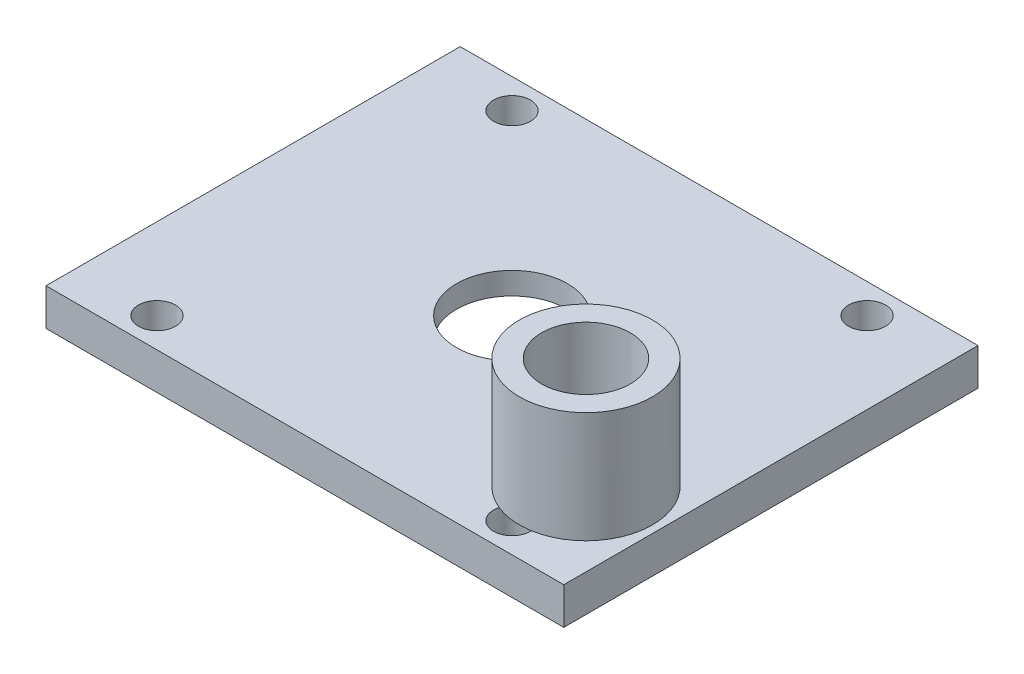
ISO-10303-21;
HEADER;
FILE_DESCRIPTION(('STEP AP214'),'2;1');
FILE_NAME('part.step','',(''),(''),'','','');
FILE_SCHEMA(('AUTOMOTIVE_DESIGN { 1 0 10303 214 1 1 1 1 }'));
ENDSEC;
DATA;
#1=APPLICATION_CONTEXT('core data for automotive mechanical design processes');
#2=APPLICATION_PROTOCOL_DEFINITION('international standard','automotive_design',2000,#1);
#3=PRODUCT_CONTEXT('',#1,'mechanical');
#4=PRODUCT('Part','Part','',(#3));
#5=PRODUCT_RELATED_PRODUCT_CATEGORY('part','',(#4));
#6=PRODUCT_DEFINITION_FORMATION('','',#4);
#7=PRODUCT_DEFINITION_CONTEXT('part definition',#1,'design');
#8=PRODUCT_DEFINITION('design','',#6,#7);
#9=PRODUCT_DEFINITION_SHAPE('','',#8);
#10=(LENGTH_UNIT() NAMED_UNIT(*) SI_UNIT(.MILLI.,.METRE.));
#11=(NAMED_UNIT(*) PLANE_ANGLE_UNIT() SI_UNIT($,.RADIAN.));
#12=(NAMED_UNIT(*) SI_UNIT($,.STERADIAN.) SOLID_ANGLE_UNIT());
#13=UNCERTAINTY_MEASURE_WITH_UNIT(LENGTH_MEASURE(1.E-05),#10,'distance_accuracy_value','');
#14=(GEOMETRIC_REPRESENTATION_CONTEXT(3) GLOBAL_UNCERTAINTY_ASSIGNED_CONTEXT((#13)) GLOBAL_UNIT_ASSIGNED_CONTEXT((#10,
#11,#12)) REPRESENTATION_CONTEXT('',''));
#15=CARTESIAN_POINT('',(0.,0.,0.));
#16=DIRECTION('',(0.,0.,1.));
#17=DIRECTION('',(1.,0.,0.));
#18=AXIS2_PLACEMENT_3D('',#15,#16,#17);
#19=CARTESIAN_POINT('',(35.,5.,28.));
#20=DIRECTION('',(-1.,0.,0.));
#21=DIRECTION('',(0.,0.,1.));
#22=AXIS2_PLACEMENT_3D('',#19,#20,#21);
#23=PLANE('',#22);
#24=DIRECTION('',(0.,0.,-1.));
#25=VECTOR('',#24,1.);
#26=CARTESIAN_POINT('',(35.,0.,28.));
#27=LINE('',#26,#25);
#28=CARTESIAN_POINT('',(35.,0.,28.));
#29=VERTEX_POINT('',#28);
#30=CARTESIAN_POINT('',(35.,0.,-28.));
#31=VERTEX_POINT('',#30);
#32=EDGE_CURVE('E134',#29,#31,#27,.T.);
#33=ORIENTED_EDGE('',*,*,#32,.T.);
#34=DIRECTION('',(0.,-1.,0.));
#35=VECTOR('',#34,1.);
#36=CARTESIAN_POINT('',(35.,5.,-28.));
#37=LINE('',#36,#35);
#38=CARTESIAN_POINT('',(35.,5.,-28.));
#39=VERTEX_POINT('',#38);
#40=EDGE_CURVE('E111',#39,#31,#37,.T.);
#41=ORIENTED_EDGE('',*,*,#40,.F.);
#42=DIRECTION('',(0.,0.,-1.));
#43=VECTOR('',#42,1.);
#44=CARTESIAN_POINT('',(35.,5.,28.));
#45=LINE('',#44,#43);
#46=CARTESIAN_POINT('',(35.,5.,28.));
#47=VERTEX_POINT('',#46);
#48=EDGE_CURVE('E127',#47,#39,#45,.T.);
#49=ORIENTED_EDGE('',*,*,#48,.F.);
#50=DIRECTION('',(0.,-1.,0.));
#51=VECTOR('',#50,1.);
#52=CARTESIAN_POINT('',(35.,5.,28.));
#53=LINE('',#52,#51);
#54=EDGE_CURVE('E122',#47,#29,#53,.T.);
#55=ORIENTED_EDGE('',*,*,#54,.T.);
#56=EDGE_LOOP('',(#33,#41,#49,#55));
#57=FACE_BOUND('',#56,.T.);
#58=ADVANCED_FACE('F39',(#57),#23,.F.);
#59=CARTESIAN_POINT('',(-35.,5.,-28.));
#60=DIRECTION('',(0.,0.,1.));
#61=DIRECTION('',(1.,0.,0.));
#62=AXIS2_PLACEMENT_3D('',#59,#60,#61);
#63=PLANE('',#62);
#64=DIRECTION('',(-1.,0.,0.));
#65=VECTOR('',#64,1.);
#66=CARTESIAN_POINT('',(-35.,0.,-28.));
#67=LINE('',#66,#65);
#68=CARTESIAN_POINT('',(-35.,0.,-28.));
#69=VERTEX_POINT('',#68);
#70=EDGE_CURVE('E131',#31,#69,#67,.T.);
#71=ORIENTED_EDGE('',*,*,#70,.T.);
#72=DIRECTION('',(0.,-1.,0.));
#73=VECTOR('',#72,1.);
#74=CARTESIAN_POINT('',(-35.,5.,-28.));
#75=LINE('',#74,#73);
#76=CARTESIAN_POINT('',(-35.,5.,-28.));
#77=VERTEX_POINT('',#76);
#78=EDGE_CURVE('E113',#77,#69,#75,.T.);
#79=ORIENTED_EDGE('',*,*,#78,.F.);
#80=DIRECTION('',(-1.,0.,0.));
#81=VECTOR('',#80,1.);
#82=CARTESIAN_POINT('',(-35.,5.,-28.));
#83=LINE('',#82,#81);
#84=EDGE_CURVE('E92',#39,#77,#83,.T.);
#85=ORIENTED_EDGE('',*,*,#84,.F.);
#86=ORIENTED_EDGE('',*,*,#40,.T.);
#87=EDGE_LOOP('',(#71,#79,#85,#86));
#88=FACE_BOUND('',#87,.T.);
#89=ADVANCED_FACE('F236',(#88),#63,.F.);
#90=CARTESIAN_POINT('',(-35.,5.,28.));
#91=DIRECTION('',(1.,0.,0.));
#92=DIRECTION('',(0.,0.,-1.));
#93=AXIS2_PLACEMENT_3D('',#90,#91,#92);
#94=PLANE('',#93);
#95=DIRECTION('',(0.,0.,1.));
#96=VECTOR('',#95,1.);
#97=CARTESIAN_POINT('',(-35.,0.,28.));
#98=LINE('',#97,#96);
#99=CARTESIAN_POINT('',(-35.,0.,28.));
#100=VERTEX_POINT('',#99);
#101=EDGE_CURVE('E128',#69,#100,#98,.T.);
#102=ORIENTED_EDGE('',*,*,#101,.T.);
#103=DIRECTION('',(0.,-1.,0.));
#104=VECTOR('',#103,1.);
#105=CARTESIAN_POINT('',(-35.,5.,28.));
#106=LINE('',#105,#104);
#107=CARTESIAN_POINT('',(-35.,5.,28.));
#108=VERTEX_POINT('',#107);
#109=EDGE_CURVE('E119',#108,#100,#106,.T.);
#110=ORIENTED_EDGE('',*,*,#109,.F.);
#111=DIRECTION('',(0.,0.,1.));
#112=VECTOR('',#111,1.);
#113=CARTESIAN_POINT('',(-35.,5.,28.));
#114=LINE('',#113,#112);
#115=EDGE_CURVE('E141',#77,#108,#114,.T.);
#116=ORIENTED_EDGE('',*,*,#115,.F.);
#117=ORIENTED_EDGE('',*,*,#78,.T.);
#118=EDGE_LOOP('',(#102,#110,#116,#117));
#119=FACE_BOUND('',#118,.T.);
#120=ADVANCED_FACE('F241',(#119),#94,.F.);
#121=CARTESIAN_POINT('',(-35.,5.,28.));
#122=DIRECTION('',(0.,0.,-1.));
#123=DIRECTION('',(-1.,0.,0.));
#124=AXIS2_PLACEMENT_3D('',#121,#122,#123);
#125=PLANE('',#124);
#126=DIRECTION('',(1.,0.,0.));
#127=VECTOR('',#126,1.);
#128=CARTESIAN_POINT('',(-35.,0.,28.));
#129=LINE('',#128,#127);
#130=EDGE_CURVE('E84',#100,#29,#129,.T.);
#131=ORIENTED_EDGE('',*,*,#130,.T.);
#132=ORIENTED_EDGE('',*,*,#54,.F.);
#133=DIRECTION('',(1.,0.,0.));
#134=VECTOR('',#133,1.);
#135=CARTESIAN_POINT('',(-35.,5.,28.));
#136=LINE('',#135,#134);
#137=EDGE_CURVE('E63',#108,#47,#136,.T.);
#138=ORIENTED_EDGE('',*,*,#137,.F.);
#139=ORIENTED_EDGE('',*,*,#109,.T.);
#140=EDGE_LOOP('',(#131,#132,#138,#139));
#141=FACE_BOUND('',#140,.T.);
#142=ADVANCED_FACE('F211',(#141),#125,.F.);
#143=CARTESIAN_POINT('',(0.,5.,0.));
#144=DIRECTION('',(0.,-1.,0.));
#145=DIRECTION('',(0.,0.,-1.));
#146=AXIS2_PLACEMENT_3D('',#143,#144,#145);
#147=PLANE('',#146);
#148=CARTESIAN_POINT('',(-23.9999999999986,5.,24.));
#149=DIRECTION('',(0.,1.,0.));
#150=DIRECTION('',(0.,0.,1.));
#151=AXIS2_PLACEMENT_3D('',#148,#149,#150);
#152=CIRCLE('',#151,2.50000000000071);
#153=CARTESIAN_POINT('',(-23.9999999999986,5.,26.5000000000007));
#154=VERTEX_POINT('',#153);
#155=EDGE_CURVE('E180',#154,#154,#152,.T.);
#156=ORIENTED_EDGE('',*,*,#155,.F.);
#157=EDGE_LOOP('',(#156));
#158=FACE_BOUND('',#157,.T.);
#159=CARTESIAN_POINT('',(24.,5.,-24.0000000000014));
#160=DIRECTION('',(0.,1.,0.));
#161=DIRECTION('',(0.,0.,1.));
#162=AXIS2_PLACEMENT_3D('',#159,#160,#161);
#163=CIRCLE('',#162,2.5000000000014);
#164=CARTESIAN_POINT('',(24.,5.,-21.5));
#165=VERTEX_POINT('',#164);
#166=EDGE_CURVE('E190',#165,#165,#163,.T.);
#167=ORIENTED_EDGE('',*,*,#166,.F.);
#168=EDGE_LOOP('',(#167));
#169=FACE_BOUND('',#168,.T.);
#170=CARTESIAN_POINT('',(-24.,5.,-24.));
#171=DIRECTION('',(0.,1.,0.));
#172=DIRECTION('',(0.,0.,1.));
#173=AXIS2_PLACEMENT_3D('',#170,#171,#172);
#174=CIRCLE('',#173,2.5);
#175=CARTESIAN_POINT('',(-24.,5.,-21.5));
#176=VERTEX_POINT('',#175);
#177=EDGE_CURVE('E172',#176,#176,#174,.T.);
#178=ORIENTED_EDGE('',*,*,#177,.F.);
#179=EDGE_LOOP('',(#178));
#180=FACE_BOUND('',#179,.T.);
#181=CARTESIAN_POINT('',(0.,5.,0.));
#182=DIRECTION('',(0.,-1.,0.));
#183=DIRECTION('',(0.,0.,-1.));
#184=AXIS2_PLACEMENT_3D('',#181,#182,#183);
#185=CIRCLE('',#184,7.5);
#186=CARTESIAN_POINT('',(0.,5.,-7.5));
#187=VERTEX_POINT('',#186);
#188=EDGE_CURVE('E156',#187,#187,#185,.T.);
#189=ORIENTED_EDGE('',*,*,#188,.T.);
#190=EDGE_LOOP('',(#189));
#191=FACE_BOUND('',#190,.T.);
#192=CARTESIAN_POINT('',(25.,5.,15.));
#193=DIRECTION('',(0.,-1.,0.));
#194=DIRECTION('',(0.,0.,-1.));
#195=AXIS2_PLACEMENT_3D('',#192,#193,#194);
#196=CIRCLE('',#195,9.);
#197=CARTESIAN_POINT('',(26.4968555287647,5.,23.8746506143063));
#198=VERTEX_POINT('',#197);
#199=CARTESIAN_POINT('',(21.5915591053841,5.,23.3296176783757));
#200=VERTEX_POINT('',#199);
#201=EDGE_CURVE('E48',#198,#200,#196,.F.);
#202=ORIENTED_EDGE('',*,*,#201,.F.);
#203=CARTESIAN_POINT('',(24.0000000000014,5.,23.9999999999986));
#204=DIRECTION('',(0.,1.,0.));
#205=DIRECTION('',(0.,0.,1.));
#206=AXIS2_PLACEMENT_3D('',#203,#204,#205);
#207=CIRCLE('',#206,2.5000000000019);
#208=EDGE_CURVE('E100',#200,#198,#207,.T.);
#209=ORIENTED_EDGE('',*,*,#208,.F.);
#210=EDGE_LOOP('',(#202,#209));
#211=FACE_BOUND('',#210,.T.);
#212=ORIENTED_EDGE('',*,*,#48,.T.);
#213=ORIENTED_EDGE('',*,*,#84,.T.);
#214=ORIENTED_EDGE('',*,*,#115,.T.);
#215=ORIENTED_EDGE('',*,*,#137,.T.);
#216=EDGE_LOOP('',(#212,#213,#214,#215));
#217=FACE_BOUND('',#216,.T.);
#218=ADVANCED_FACE('F106',(#158,#169,#180,#191,#211,#217),#147,.F.);
#219=CARTESIAN_POINT('',(0.,0.,0.));
#220=DIRECTION('',(0.,-1.,0.));
#221=DIRECTION('',(0.,0.,-1.));
#222=AXIS2_PLACEMENT_3D('',#219,#220,#221);
#223=PLANE('',#222);
#224=CARTESIAN_POINT('',(-23.9999999999986,0.,24.));
#225=DIRECTION('',(0.,1.,0.));
#226=DIRECTION('',(0.,0.,1.));
#227=AXIS2_PLACEMENT_3D('',#224,#225,#226);
#228=CIRCLE('',#227,2.50000000000071);
#229=CARTESIAN_POINT('',(-23.9999999999986,0.,26.5000000000007));
#230=VERTEX_POINT('',#229);
#231=EDGE_CURVE('E108',#230,#230,#228,.T.);
#232=ORIENTED_EDGE('',*,*,#231,.T.);
#233=EDGE_LOOP('',(#232));
#234=FACE_BOUND('',#233,.T.);
#235=CARTESIAN_POINT('',(24.0000000000014,0.,23.9999999999986));
#236=DIRECTION('',(0.,1.,0.));
#237=DIRECTION('',(0.,0.,1.));
#238=AXIS2_PLACEMENT_3D('',#235,#236,#237);
#239=CIRCLE('',#238,2.5000000000019);
#240=CARTESIAN_POINT('',(24.0000000000014,0.,26.5000000000005));
#241=VERTEX_POINT('',#240);
#242=EDGE_CURVE('E103',#241,#241,#239,.T.);
#243=ORIENTED_EDGE('',*,*,#242,.T.);
#244=EDGE_LOOP('',(#243));
#245=FACE_BOUND('',#244,.T.);
#246=CARTESIAN_POINT('',(24.,0.,-24.0000000000014));
#247=DIRECTION('',(0.,1.,0.));
#248=DIRECTION('',(0.,0.,1.));
#249=AXIS2_PLACEMENT_3D('',#246,#247,#248);
#250=CIRCLE('',#249,2.5000000000014);
#251=CARTESIAN_POINT('',(24.,0.,-21.5));
#252=VERTEX_POINT('',#251);
#253=EDGE_CURVE('E176',#252,#252,#250,.T.);
#254=ORIENTED_EDGE('',*,*,#253,.T.);
#255=EDGE_LOOP('',(#254));
#256=FACE_BOUND('',#255,.T.);
#257=CARTESIAN_POINT('',(-24.,0.,-24.));
#258=DIRECTION('',(0.,1.,0.));
#259=DIRECTION('',(0.,0.,1.));
#260=AXIS2_PLACEMENT_3D('',#257,#258,#259);
#261=CIRCLE('',#260,2.5);
#262=CARTESIAN_POINT('',(-24.,0.,-21.5));
#263=VERTEX_POINT('',#262);
#264=EDGE_CURVE('E171',#263,#263,#261,.T.);
#265=ORIENTED_EDGE('',*,*,#264,.T.);
#266=EDGE_LOOP('',(#265));
#267=FACE_BOUND('',#266,.T.);
#268=CARTESIAN_POINT('',(0.,0.,0.));
#269=DIRECTION('',(0.,-1.,0.));
#270=DIRECTION('',(0.,0.,-1.));
#271=AXIS2_PLACEMENT_3D('',#268,#269,#270);
#272=CIRCLE('',#271,19.);
#273=CARTESIAN_POINT('',(0.,0.,-19.));
#274=VERTEX_POINT('',#273);
#275=EDGE_CURVE('E152',#274,#274,#272,.T.);
#276=ORIENTED_EDGE('',*,*,#275,.F.);
#277=EDGE_LOOP('',(#276));
#278=FACE_BOUND('',#277,.T.);
#279=ORIENTED_EDGE('',*,*,#32,.F.);
#280=ORIENTED_EDGE('',*,*,#130,.F.);
#281=ORIENTED_EDGE('',*,*,#101,.F.);
#282=ORIENTED_EDGE('',*,*,#70,.F.);
#283=EDGE_LOOP('',(#279,#280,#281,#282));
#284=FACE_BOUND('',#283,.T.);
#285=ADVANCED_FACE('F198',(#234,#245,#256,#267,#278,#284),#223,.T.);
#286=CARTESIAN_POINT('',(25.,20.,15.));
#287=DIRECTION('',(0.,-1.,0.));
#288=DIRECTION('',(0.,0.,-1.));
#289=AXIS2_PLACEMENT_3D('',#286,#287,#288);
#290=CYLINDRICAL_SURFACE('',#289,9.);
#291=CARTESIAN_POINT('',(25.,20.,15.));
#292=DIRECTION('',(0.,1.,0.));
#293=DIRECTION('',(0.,0.,1.));
#294=AXIS2_PLACEMENT_3D('',#291,#292,#293);
#295=CIRCLE('',#294,9.);
#296=CARTESIAN_POINT('',(25.,20.,24.));
#297=VERTEX_POINT('',#296);
#298=EDGE_CURVE('E138',#297,#297,#295,.T.);
#299=ORIENTED_EDGE('',*,*,#298,.F.);
#300=EDGE_LOOP('',(#299));
#301=FACE_BOUND('',#300,.T.);
#302=EDGE_CURVE('E11',#200,#198,#196,.F.);
#303=ORIENTED_EDGE('',*,*,#302,.T.);
#304=ORIENTED_EDGE('',*,*,#201,.T.);
#305=EDGE_LOOP('',(#303,#304));
#306=FACE_BOUND('',#305,.T.);
#307=ADVANCED_FACE('F109',(#301,#306),#290,.T.);
#308=CARTESIAN_POINT('',(25.,20.,15.));
#309=DIRECTION('',(0.,1.,0.));
#310=DIRECTION('',(0.,0.,1.));
#311=AXIS2_PLACEMENT_3D('',#308,#309,#310);
#312=PLANE('',#311);
#313=CARTESIAN_POINT('',(25.,20.,15.));
#314=DIRECTION('',(0.,1.,0.));
#315=DIRECTION('',(0.,0.,1.));
#316=AXIS2_PLACEMENT_3D('',#313,#314,#315);
#317=CIRCLE('',#316,6.);
#318=CARTESIAN_POINT('',(25.,20.,21.));
#319=VERTEX_POINT('',#318);
#320=EDGE_CURVE('E167',#319,#319,#317,.T.);
#321=ORIENTED_EDGE('',*,*,#320,.F.);
#322=EDGE_LOOP('',(#321));
#323=FACE_BOUND('',#322,.T.);
#324=ORIENTED_EDGE('',*,*,#298,.T.);
#325=EDGE_LOOP('',(#324));
#326=FACE_BOUND('',#325,.T.);
#327=ADVANCED_FACE('F262',(#323,#326),#312,.T.);
#328=CARTESIAN_POINT('',(0.,2.,0.));
#329=DIRECTION('',(0.,-1.,0.));
#330=DIRECTION('',(0.,0.,-1.));
#331=AXIS2_PLACEMENT_3D('',#328,#329,#330);
#332=CYLINDRICAL_SURFACE('',#331,19.);
#333=CARTESIAN_POINT('',(0.,2.,0.));
#334=DIRECTION('',(0.,-1.,0.));
#335=DIRECTION('',(0.,0.,-1.));
#336=AXIS2_PLACEMENT_3D('',#333,#334,#335);
#337=CIRCLE('',#336,19.);
#338=CARTESIAN_POINT('',(0.,2.,-19.));
#339=VERTEX_POINT('',#338);
#340=EDGE_CURVE('E151',#339,#339,#337,.T.);
#341=ORIENTED_EDGE('',*,*,#340,.F.);
#342=EDGE_LOOP('',(#341));
#343=FACE_BOUND('',#342,.T.);
#344=ORIENTED_EDGE('',*,*,#275,.T.);
#345=EDGE_LOOP('',(#344));
#346=FACE_BOUND('',#345,.T.);
#347=ADVANCED_FACE('F231',(#343,#346),#332,.F.);
#348=CARTESIAN_POINT('',(0.,2.,0.));
#349=DIRECTION('',(0.,-1.,0.));
#350=DIRECTION('',(0.,0.,-1.));
#351=AXIS2_PLACEMENT_3D('',#348,#349,#350);
#352=PLANE('',#351);
#353=CARTESIAN_POINT('',(0.,2.,0.));
#354=DIRECTION('',(0.,-1.,0.));
#355=DIRECTION('',(0.,0.,-1.));
#356=AXIS2_PLACEMENT_3D('',#353,#354,#355);
#357=CIRCLE('',#356,7.5);
#358=CARTESIAN_POINT('',(0.,2.,-7.5));
#359=VERTEX_POINT('',#358);
#360=EDGE_CURVE('E42',#359,#359,#357,.T.);
#361=ORIENTED_EDGE('',*,*,#360,.F.);
#362=EDGE_LOOP('',(#361));
#363=FACE_BOUND('',#362,.T.);
#364=ORIENTED_EDGE('',*,*,#340,.T.);
#365=EDGE_LOOP('',(#364));
#366=FACE_BOUND('',#365,.T.);
#367=ADVANCED_FACE('F221',(#363,#366),#352,.T.);
#368=CARTESIAN_POINT('',(0.,20.,0.));
#369=DIRECTION('',(0.,-1.,0.));
#370=DIRECTION('',(0.,0.,-1.));
#371=AXIS2_PLACEMENT_3D('',#368,#369,#370);
#372=CYLINDRICAL_SURFACE('',#371,7.5);
#373=ORIENTED_EDGE('',*,*,#360,.T.);
#374=EDGE_LOOP('',(#373));
#375=FACE_BOUND('',#374,.T.);
#376=ORIENTED_EDGE('',*,*,#188,.F.);
#377=EDGE_LOOP('',(#376));
#378=FACE_BOUND('',#377,.T.);
#379=ADVANCED_FACE('F218',(#375,#378),#372,.F.);
#380=CARTESIAN_POINT('',(0.,5.,0.));
#381=DIRECTION('',(0.,-1.,0.));
#382=DIRECTION('',(0.,0.,-1.));
#383=AXIS2_PLACEMENT_3D('',#380,#381,#382);
#384=PLANE('',#383);
#385=CARTESIAN_POINT('',(25.,5.,15.));
#386=DIRECTION('',(0.,-1.,0.));
#387=DIRECTION('',(0.,0.,-1.));
#388=AXIS2_PLACEMENT_3D('',#385,#386,#387);
#389=CIRCLE('',#388,6.);
#390=CARTESIAN_POINT('',(25.,5.,9.));
#391=VERTEX_POINT('',#390);
#392=EDGE_CURVE('E163',#391,#391,#389,.F.);
#393=ORIENTED_EDGE('',*,*,#392,.T.);
#394=EDGE_LOOP('',(#393));
#395=FACE_BOUND('',#394,.T.);
#396=ADVANCED_FACE('F220',(#395),#384,.F.);
#397=CARTESIAN_POINT('',(25.,-11.9705627484771,15.));
#398=DIRECTION('',(0.,1.,0.));
#399=DIRECTION('',(0.,0.,1.));
#400=AXIS2_PLACEMENT_3D('',#397,#398,#399);
#401=CYLINDRICAL_SURFACE('',#400,6.);
#402=ORIENTED_EDGE('',*,*,#320,.T.);
#403=EDGE_LOOP('',(#402));
#404=FACE_BOUND('',#403,.T.);
#405=ORIENTED_EDGE('',*,*,#392,.F.);
#406=EDGE_LOOP('',(#405));
#407=FACE_BOUND('',#406,.T.);
#408=ADVANCED_FACE('F228',(#404,#407),#401,.F.);
#409=CARTESIAN_POINT('',(24.0000000000014,5.,23.9999999999986));
#410=DIRECTION('',(0.,1.,0.));
#411=DIRECTION('',(0.,0.,1.));
#412=AXIS2_PLACEMENT_3D('',#409,#410,#411);
#413=PLANE('',#412);
#414=EDGE_CURVE('E54',#198,#200,#207,.T.);
#415=ORIENTED_EDGE('',*,*,#414,.F.);
#416=ORIENTED_EDGE('',*,*,#302,.F.);
#417=EDGE_LOOP('',(#415,#416));
#418=FACE_BOUND('',#417,.T.);
#419=ADVANCED_FACE('F94',(#418),#413,.F.);
#420=CARTESIAN_POINT('',(24.0000000000014,0.,23.9999999999986));
#421=DIRECTION('',(0.,1.,0.));
#422=DIRECTION('',(0.,0.,1.));
#423=AXIS2_PLACEMENT_3D('',#420,#421,#422);
#424=CYLINDRICAL_SURFACE('',#423,2.5000000000019);
#425=ORIENTED_EDGE('',*,*,#242,.F.);
#426=EDGE_LOOP('',(#425));
#427=FACE_BOUND('',#426,.T.);
#428=ORIENTED_EDGE('',*,*,#414,.T.);
#429=ORIENTED_EDGE('',*,*,#208,.T.);
#430=EDGE_LOOP('',(#428,#429));
#431=FACE_BOUND('',#430,.T.);
#432=ADVANCED_FACE('F99',(#427,#431),#424,.F.);
#433=CARTESIAN_POINT('',(-24.,0.,-24.));
#434=DIRECTION('',(0.,1.,0.));
#435=DIRECTION('',(0.,0.,1.));
#436=AXIS2_PLACEMENT_3D('',#433,#434,#435);
#437=CYLINDRICAL_SURFACE('',#436,2.5);
#438=ORIENTED_EDGE('',*,*,#264,.F.);
#439=EDGE_LOOP('',(#438));
#440=FACE_BOUND('',#439,.T.);
#441=ORIENTED_EDGE('',*,*,#177,.T.);
#442=EDGE_LOOP('',(#441));
#443=FACE_BOUND('',#442,.T.);
#444=ADVANCED_FACE('F205',(#440,#443),#437,.F.);
#445=CARTESIAN_POINT('',(24.,0.,-24.0000000000014));
#446=DIRECTION('',(0.,1.,0.));
#447=DIRECTION('',(0.,0.,1.));
#448=AXIS2_PLACEMENT_3D('',#445,#446,#447);
#449=CYLINDRICAL_SURFACE('',#448,2.5000000000014);
#450=ORIENTED_EDGE('',*,*,#253,.F.);
#451=EDGE_LOOP('',(#450));
#452=FACE_BOUND('',#451,.T.);
#453=ORIENTED_EDGE('',*,*,#166,.T.);
#454=EDGE_LOOP('',(#453));
#455=FACE_BOUND('',#454,.T.);
#456=ADVANCED_FACE('F201',(#452,#455),#449,.F.);
#457=CARTESIAN_POINT('',(-23.9999999999986,0.,24.));
#458=DIRECTION('',(0.,1.,0.));
#459=DIRECTION('',(0.,0.,1.));
#460=AXIS2_PLACEMENT_3D('',#457,#458,#459);
#461=CYLINDRICAL_SURFACE('',#460,2.50000000000071);
#462=ORIENTED_EDGE('',*,*,#231,.F.);
#463=EDGE_LOOP('',(#462));
#464=FACE_BOUND('',#463,.T.);
#465=ORIENTED_EDGE('',*,*,#155,.T.);
#466=EDGE_LOOP('',(#465));
#467=FACE_BOUND('',#466,.T.);
#468=ADVANCED_FACE('F204',(#464,#467),#461,.F.);
#469=CLOSED_SHELL('',(#58,#89,#120,#142,#218,#285,#307,#327,#347,#367,#379,#396,#408,#419,#432,
#444,#456,#468));
#470=MANIFOLD_SOLID_BREP('B2',#469);
#471=ADVANCED_BREP_SHAPE_REPRESENTATION('',(#18,#470),#14);
#472=SHAPE_DEFINITION_REPRESENTATION(#9,#471);
ENDSEC;
END-ISO-10303-21;
